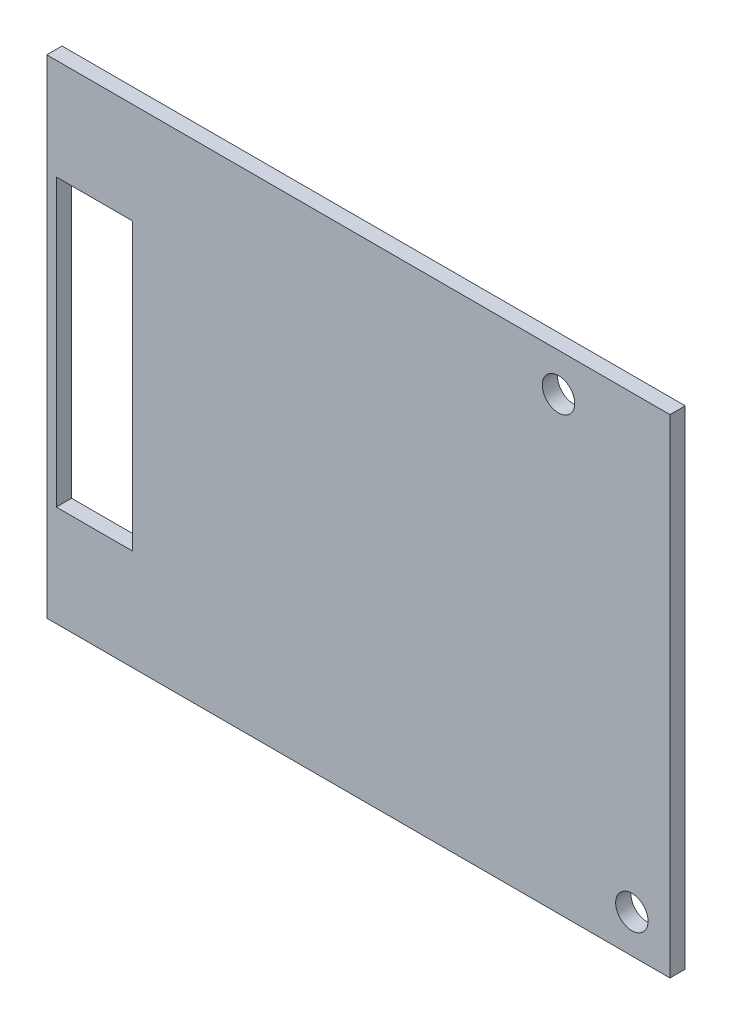
ISO-10303-21;
HEADER;
FILE_DESCRIPTION(('STEP AP214'),'2;1');
FILE_NAME('part.step','',(''),(''),'','','');
FILE_SCHEMA(('AUTOMOTIVE_DESIGN { 1 0 10303 214 1 1 1 1 }'));
ENDSEC;
DATA;
#1=APPLICATION_CONTEXT('core data for automotive mechanical design processes');
#2=APPLICATION_PROTOCOL_DEFINITION('international standard','automotive_design',2000,#1);
#3=PRODUCT_CONTEXT('',#1,'mechanical');
#4=PRODUCT('Part','Part','',(#3));
#5=PRODUCT_RELATED_PRODUCT_CATEGORY('part','',(#4));
#6=PRODUCT_DEFINITION_FORMATION('','',#4);
#7=PRODUCT_DEFINITION_CONTEXT('part definition',#1,'design');
#8=PRODUCT_DEFINITION('design','',#6,#7);
#9=PRODUCT_DEFINITION_SHAPE('','',#8);
#10=(LENGTH_UNIT() NAMED_UNIT(*) SI_UNIT(.MILLI.,.METRE.));
#11=(NAMED_UNIT(*) PLANE_ANGLE_UNIT() SI_UNIT($,.RADIAN.));
#12=(NAMED_UNIT(*) SI_UNIT($,.STERADIAN.) SOLID_ANGLE_UNIT());
#13=UNCERTAINTY_MEASURE_WITH_UNIT(LENGTH_MEASURE(1.E-05),#10,'distance_accuracy_value','');
#14=(GEOMETRIC_REPRESENTATION_CONTEXT(3) GLOBAL_UNCERTAINTY_ASSIGNED_CONTEXT((#13)) GLOBAL_UNIT_ASSIGNED_CONTEXT((#10,
#11,#12)) REPRESENTATION_CONTEXT('',''));
#15=CARTESIAN_POINT('',(0.,0.,0.));
#16=DIRECTION('',(0.,0.,1.));
#17=DIRECTION('',(1.,0.,0.));
#18=AXIS2_PLACEMENT_3D('',#15,#16,#17);
#19=CARTESIAN_POINT('',(0.,0.,1.6));
#20=DIRECTION('',(0.,0.,1.));
#21=DIRECTION('',(1.,0.,0.));
#22=AXIS2_PLACEMENT_3D('',#19,#20,#21);
#23=PLANE('',#22);
#24=CARTESIAN_POINT('',(61.4,4.,1.6));
#25=DIRECTION('',(0.,0.,1.));
#26=DIRECTION('',(1.,0.,0.));
#27=AXIS2_PLACEMENT_3D('',#24,#25,#26);
#28=CIRCLE('',#27,1.70000000000001);
#29=CARTESIAN_POINT('',(63.1,4.,1.6));
#30=VERTEX_POINT('',#29);
#31=EDGE_CURVE('E128',#30,#30,#28,.T.);
#32=ORIENTED_EDGE('',*,*,#31,.F.);
#33=EDGE_LOOP('',(#32));
#34=FACE_BOUND('',#33,.T.);
#35=DIRECTION('',(0.,-1.,0.));
#36=VECTOR('',#35,1.);
#37=CARTESIAN_POINT('',(0.,51.2,1.6));
#38=LINE('',#37,#36);
#39=CARTESIAN_POINT('',(0.,51.2,1.6));
#40=VERTEX_POINT('',#39);
#41=CARTESIAN_POINT('',(0.,0.,1.6));
#42=VERTEX_POINT('',#41);
#43=EDGE_CURVE('E138',#40,#42,#38,.T.);
#44=ORIENTED_EDGE('',*,*,#43,.T.);
#45=DIRECTION('',(1.,0.,0.));
#46=VECTOR('',#45,1.);
#47=CARTESIAN_POINT('',(0.,0.,1.6));
#48=LINE('',#47,#46);
#49=CARTESIAN_POINT('',(65.4,0.,1.6));
#50=VERTEX_POINT('',#49);
#51=EDGE_CURVE('E141',#42,#50,#48,.T.);
#52=ORIENTED_EDGE('',*,*,#51,.T.);
#53=DIRECTION('',(0.,1.,0.));
#54=VECTOR('',#53,1.);
#55=CARTESIAN_POINT('',(65.4,51.2,1.6));
#56=LINE('',#55,#54);
#57=CARTESIAN_POINT('',(65.4,51.2,1.6));
#58=VERTEX_POINT('',#57);
#59=EDGE_CURVE('E144',#50,#58,#56,.T.);
#60=ORIENTED_EDGE('',*,*,#59,.T.);
#61=DIRECTION('',(-1.,0.,0.));
#62=VECTOR('',#61,1.);
#63=CARTESIAN_POINT('',(0.,51.2,1.6));
#64=LINE('',#63,#62);
#65=EDGE_CURVE('E146',#58,#40,#64,.T.);
#66=ORIENTED_EDGE('',*,*,#65,.T.);
#67=EDGE_LOOP('',(#44,#52,#60,#66));
#68=FACE_BOUND('',#67,.T.);
#69=DIRECTION('',(1.,0.,0.));
#70=VECTOR('',#69,1.);
#71=CARTESIAN_POINT('',(1.,10.6,1.6));
#72=LINE('',#71,#70);
#73=CARTESIAN_POINT('',(1.,10.6,1.6));
#74=VERTEX_POINT('',#73);
#75=CARTESIAN_POINT('',(9.00000000000001,10.6,1.6));
#76=VERTEX_POINT('',#75);
#77=EDGE_CURVE('E107',#74,#76,#72,.T.);
#78=ORIENTED_EDGE('',*,*,#77,.F.);
#79=DIRECTION('',(0.,-1.,0.));
#80=VECTOR('',#79,1.);
#81=CARTESIAN_POINT('',(1.,40.6,1.6));
#82=LINE('',#81,#80);
#83=CARTESIAN_POINT('',(1.,40.6,1.6));
#84=VERTEX_POINT('',#83);
#85=EDGE_CURVE('E99',#84,#74,#82,.T.);
#86=ORIENTED_EDGE('',*,*,#85,.F.);
#87=DIRECTION('',(-1.,0.,0.));
#88=VECTOR('',#87,1.);
#89=CARTESIAN_POINT('',(1.,40.6,1.6));
#90=LINE('',#89,#88);
#91=CARTESIAN_POINT('',(9.00000000000001,40.6,1.6));
#92=VERTEX_POINT('',#91);
#93=EDGE_CURVE('E122',#92,#84,#90,.T.);
#94=ORIENTED_EDGE('',*,*,#93,.F.);
#95=DIRECTION('',(0.,1.,0.));
#96=VECTOR('',#95,1.);
#97=CARTESIAN_POINT('',(9.00000000000001,40.6,1.6));
#98=LINE('',#97,#96);
#99=EDGE_CURVE('E120',#76,#92,#98,.T.);
#100=ORIENTED_EDGE('',*,*,#99,.F.);
#101=EDGE_LOOP('',(#78,#86,#94,#100));
#102=FACE_BOUND('',#101,.T.);
#103=CARTESIAN_POINT('',(53.7,47.2,1.6));
#104=DIRECTION('',(0.,0.,1.));
#105=DIRECTION('',(1.,0.,0.));
#106=AXIS2_PLACEMENT_3D('',#103,#104,#105);
#107=CIRCLE('',#106,1.7);
#108=CARTESIAN_POINT('',(55.4,47.2,1.6));
#109=VERTEX_POINT('',#108);
#110=EDGE_CURVE('E228',#109,#109,#107,.T.);
#111=ORIENTED_EDGE('',*,*,#110,.F.);
#112=EDGE_LOOP('',(#111));
#113=FACE_BOUND('',#112,.T.);
#114=ADVANCED_FACE('F34',(#34,#68,#102,#113),#23,.T.);
#115=CARTESIAN_POINT('',(0.,0.,0.));
#116=DIRECTION('',(0.,0.,1.));
#117=DIRECTION('',(1.,0.,0.));
#118=AXIS2_PLACEMENT_3D('',#115,#116,#117);
#119=PLANE('',#118);
#120=DIRECTION('',(0.,-1.,0.));
#121=VECTOR('',#120,1.);
#122=CARTESIAN_POINT('',(0.,51.2,0.));
#123=LINE('',#122,#121);
#124=CARTESIAN_POINT('',(0.,51.2,0.));
#125=VERTEX_POINT('',#124);
#126=CARTESIAN_POINT('',(0.,0.,0.));
#127=VERTEX_POINT('',#126);
#128=EDGE_CURVE('E115',#125,#127,#123,.T.);
#129=ORIENTED_EDGE('',*,*,#128,.F.);
#130=DIRECTION('',(-1.,0.,0.));
#131=VECTOR('',#130,1.);
#132=CARTESIAN_POINT('',(0.,51.2,0.));
#133=LINE('',#132,#131);
#134=CARTESIAN_POINT('',(65.4,51.2,0.));
#135=VERTEX_POINT('',#134);
#136=EDGE_CURVE('E142',#135,#125,#133,.T.);
#137=ORIENTED_EDGE('',*,*,#136,.F.);
#138=DIRECTION('',(0.,1.,0.));
#139=VECTOR('',#138,1.);
#140=CARTESIAN_POINT('',(65.4,51.2,0.));
#141=LINE('',#140,#139);
#142=CARTESIAN_POINT('',(65.4,0.,0.));
#143=VERTEX_POINT('',#142);
#144=EDGE_CURVE('E153',#143,#135,#141,.T.);
#145=ORIENTED_EDGE('',*,*,#144,.F.);
#146=DIRECTION('',(1.,0.,0.));
#147=VECTOR('',#146,1.);
#148=CARTESIAN_POINT('',(0.,0.,0.));
#149=LINE('',#148,#147);
#150=EDGE_CURVE('E151',#127,#143,#149,.T.);
#151=ORIENTED_EDGE('',*,*,#150,.F.);
#152=EDGE_LOOP('',(#129,#137,#145,#151));
#153=FACE_BOUND('',#152,.T.);
#154=DIRECTION('',(0.,-1.,0.));
#155=VECTOR('',#154,1.);
#156=CARTESIAN_POINT('',(1.,40.6,0.));
#157=LINE('',#156,#155);
#158=CARTESIAN_POINT('',(1.,40.6,0.));
#159=VERTEX_POINT('',#158);
#160=CARTESIAN_POINT('',(1.,10.6,0.));
#161=VERTEX_POINT('',#160);
#162=EDGE_CURVE('E57',#159,#161,#157,.T.);
#163=ORIENTED_EDGE('',*,*,#162,.T.);
#164=DIRECTION('',(1.,0.,0.));
#165=VECTOR('',#164,1.);
#166=CARTESIAN_POINT('',(1.,10.6,0.));
#167=LINE('',#166,#165);
#168=CARTESIAN_POINT('',(9.00000000000001,10.6,0.));
#169=VERTEX_POINT('',#168);
#170=EDGE_CURVE('E114',#161,#169,#167,.T.);
#171=ORIENTED_EDGE('',*,*,#170,.T.);
#172=DIRECTION('',(0.,1.,0.));
#173=VECTOR('',#172,1.);
#174=CARTESIAN_POINT('',(9.00000000000001,40.6,0.));
#175=LINE('',#174,#173);
#176=CARTESIAN_POINT('',(9.00000000000001,40.6,0.));
#177=VERTEX_POINT('',#176);
#178=EDGE_CURVE('E130',#169,#177,#175,.T.);
#179=ORIENTED_EDGE('',*,*,#178,.T.);
#180=DIRECTION('',(-1.,0.,0.));
#181=VECTOR('',#180,1.);
#182=CARTESIAN_POINT('',(1.,40.6,0.));
#183=LINE('',#182,#181);
#184=EDGE_CURVE('E108',#177,#159,#183,.T.);
#185=ORIENTED_EDGE('',*,*,#184,.T.);
#186=EDGE_LOOP('',(#163,#171,#179,#185));
#187=FACE_BOUND('',#186,.T.);
#188=CARTESIAN_POINT('',(61.4,4.,0.));
#189=DIRECTION('',(0.,0.,1.));
#190=DIRECTION('',(1.,0.,0.));
#191=AXIS2_PLACEMENT_3D('',#188,#189,#190);
#192=CIRCLE('',#191,1.70000000000001);
#193=CARTESIAN_POINT('',(63.1,4.,0.));
#194=VERTEX_POINT('',#193);
#195=EDGE_CURVE('E234',#194,#194,#192,.T.);
#196=ORIENTED_EDGE('',*,*,#195,.T.);
#197=EDGE_LOOP('',(#196));
#198=FACE_BOUND('',#197,.T.);
#199=CARTESIAN_POINT('',(53.7,47.2,0.));
#200=DIRECTION('',(0.,0.,1.));
#201=DIRECTION('',(1.,0.,0.));
#202=AXIS2_PLACEMENT_3D('',#199,#200,#201);
#203=CIRCLE('',#202,1.7);
#204=CARTESIAN_POINT('',(55.4,47.2,0.));
#205=VERTEX_POINT('',#204);
#206=EDGE_CURVE('E231',#205,#205,#203,.T.);
#207=ORIENTED_EDGE('',*,*,#206,.T.);
#208=EDGE_LOOP('',(#207));
#209=FACE_BOUND('',#208,.T.);
#210=ADVANCED_FACE('F171',(#153,#187,#198,#209),#119,.F.);
#211=CARTESIAN_POINT('',(0.,51.2,1.6));
#212=DIRECTION('',(1.,0.,0.));
#213=DIRECTION('',(0.,0.,-1.));
#214=AXIS2_PLACEMENT_3D('',#211,#212,#213);
#215=PLANE('',#214);
#216=ORIENTED_EDGE('',*,*,#128,.T.);
#217=DIRECTION('',(0.,0.,-1.));
#218=VECTOR('',#217,1.);
#219=CARTESIAN_POINT('',(0.,0.,1.6));
#220=LINE('',#219,#218);
#221=EDGE_CURVE('E11',#42,#127,#220,.T.);
#222=ORIENTED_EDGE('',*,*,#221,.F.);
#223=ORIENTED_EDGE('',*,*,#43,.F.);
#224=DIRECTION('',(0.,0.,-1.));
#225=VECTOR('',#224,1.);
#226=CARTESIAN_POINT('',(0.,51.2,1.6));
#227=LINE('',#226,#225);
#228=EDGE_CURVE('E148',#40,#125,#227,.T.);
#229=ORIENTED_EDGE('',*,*,#228,.T.);
#230=EDGE_LOOP('',(#216,#222,#223,#229));
#231=FACE_BOUND('',#230,.T.);
#232=ADVANCED_FACE('F36',(#231),#215,.F.);
#233=CARTESIAN_POINT('',(0.,0.,1.6));
#234=DIRECTION('',(0.,1.,0.));
#235=DIRECTION('',(0.,0.,1.));
#236=AXIS2_PLACEMENT_3D('',#233,#234,#235);
#237=PLANE('',#236);
#238=ORIENTED_EDGE('',*,*,#150,.T.);
#239=DIRECTION('',(0.,0.,-1.));
#240=VECTOR('',#239,1.);
#241=CARTESIAN_POINT('',(65.4,0.,1.6));
#242=LINE('',#241,#240);
#243=EDGE_CURVE('E42',#50,#143,#242,.T.);
#244=ORIENTED_EDGE('',*,*,#243,.F.);
#245=ORIENTED_EDGE('',*,*,#51,.F.);
#246=ORIENTED_EDGE('',*,*,#221,.T.);
#247=EDGE_LOOP('',(#238,#244,#245,#246));
#248=FACE_BOUND('',#247,.T.);
#249=ADVANCED_FACE('F181',(#248),#237,.F.);
#250=CARTESIAN_POINT('',(65.4,51.2,1.6));
#251=DIRECTION('',(-1.,0.,0.));
#252=DIRECTION('',(0.,0.,1.));
#253=AXIS2_PLACEMENT_3D('',#250,#251,#252);
#254=PLANE('',#253);
#255=ORIENTED_EDGE('',*,*,#144,.T.);
#256=DIRECTION('',(0.,0.,-1.));
#257=VECTOR('',#256,1.);
#258=CARTESIAN_POINT('',(65.4,51.2,1.6));
#259=LINE('',#258,#257);
#260=EDGE_CURVE('E158',#58,#135,#259,.T.);
#261=ORIENTED_EDGE('',*,*,#260,.F.);
#262=ORIENTED_EDGE('',*,*,#59,.F.);
#263=ORIENTED_EDGE('',*,*,#243,.T.);
#264=EDGE_LOOP('',(#255,#261,#262,#263));
#265=FACE_BOUND('',#264,.T.);
#266=ADVANCED_FACE('F165',(#265),#254,.F.);
#267=CARTESIAN_POINT('',(0.,51.2,1.6));
#268=DIRECTION('',(0.,-1.,0.));
#269=DIRECTION('',(0.,0.,-1.));
#270=AXIS2_PLACEMENT_3D('',#267,#268,#269);
#271=PLANE('',#270);
#272=ORIENTED_EDGE('',*,*,#136,.T.);
#273=ORIENTED_EDGE('',*,*,#228,.F.);
#274=ORIENTED_EDGE('',*,*,#65,.F.);
#275=ORIENTED_EDGE('',*,*,#260,.T.);
#276=EDGE_LOOP('',(#272,#273,#274,#275));
#277=FACE_BOUND('',#276,.T.);
#278=ADVANCED_FACE('F175',(#277),#271,.F.);
#279=CARTESIAN_POINT('',(1.,40.6,1.6));
#280=DIRECTION('',(1.,0.,0.));
#281=DIRECTION('',(0.,0.,-1.));
#282=AXIS2_PLACEMENT_3D('',#279,#280,#281);
#283=PLANE('',#282);
#284=ORIENTED_EDGE('',*,*,#162,.F.);
#285=DIRECTION('',(0.,0.,-1.));
#286=VECTOR('',#285,1.);
#287=CARTESIAN_POINT('',(1.,40.6,1.6));
#288=LINE('',#287,#286);
#289=EDGE_CURVE('E103',#84,#159,#288,.T.);
#290=ORIENTED_EDGE('',*,*,#289,.F.);
#291=ORIENTED_EDGE('',*,*,#85,.T.);
#292=DIRECTION('',(0.,0.,-1.));
#293=VECTOR('',#292,1.);
#294=CARTESIAN_POINT('',(1.,10.6,1.6));
#295=LINE('',#294,#293);
#296=EDGE_CURVE('E102',#74,#161,#295,.T.);
#297=ORIENTED_EDGE('',*,*,#296,.T.);
#298=EDGE_LOOP('',(#284,#290,#291,#297));
#299=FACE_BOUND('',#298,.T.);
#300=ADVANCED_FACE('F101',(#299),#283,.T.);
#301=CARTESIAN_POINT('',(1.,10.6,1.6));
#302=DIRECTION('',(0.,1.,0.));
#303=DIRECTION('',(0.,0.,1.));
#304=AXIS2_PLACEMENT_3D('',#301,#302,#303);
#305=PLANE('',#304);
#306=ORIENTED_EDGE('',*,*,#170,.F.);
#307=ORIENTED_EDGE('',*,*,#296,.F.);
#308=ORIENTED_EDGE('',*,*,#77,.T.);
#309=DIRECTION('',(0.,0.,-1.));
#310=VECTOR('',#309,1.);
#311=CARTESIAN_POINT('',(9.00000000000001,10.6,1.6));
#312=LINE('',#311,#310);
#313=EDGE_CURVE('E116',#76,#169,#312,.T.);
#314=ORIENTED_EDGE('',*,*,#313,.T.);
#315=EDGE_LOOP('',(#306,#307,#308,#314));
#316=FACE_BOUND('',#315,.T.);
#317=ADVANCED_FACE('F111',(#316),#305,.T.);
#318=CARTESIAN_POINT('',(9.00000000000001,40.6,1.6));
#319=DIRECTION('',(-1.,0.,0.));
#320=DIRECTION('',(0.,0.,1.));
#321=AXIS2_PLACEMENT_3D('',#318,#319,#320);
#322=PLANE('',#321);
#323=ORIENTED_EDGE('',*,*,#178,.F.);
#324=ORIENTED_EDGE('',*,*,#313,.F.);
#325=ORIENTED_EDGE('',*,*,#99,.T.);
#326=DIRECTION('',(0.,0.,-1.));
#327=VECTOR('',#326,1.);
#328=CARTESIAN_POINT('',(9.00000000000001,40.6,1.6));
#329=LINE('',#328,#327);
#330=EDGE_CURVE('E49',#92,#177,#329,.T.);
#331=ORIENTED_EDGE('',*,*,#330,.T.);
#332=EDGE_LOOP('',(#323,#324,#325,#331));
#333=FACE_BOUND('',#332,.T.);
#334=ADVANCED_FACE('F206',(#333),#322,.T.);
#335=CARTESIAN_POINT('',(1.,40.6,1.6));
#336=DIRECTION('',(0.,-1.,0.));
#337=DIRECTION('',(0.,0.,-1.));
#338=AXIS2_PLACEMENT_3D('',#335,#336,#337);
#339=PLANE('',#338);
#340=ORIENTED_EDGE('',*,*,#184,.F.);
#341=ORIENTED_EDGE('',*,*,#330,.F.);
#342=ORIENTED_EDGE('',*,*,#93,.T.);
#343=ORIENTED_EDGE('',*,*,#289,.T.);
#344=EDGE_LOOP('',(#340,#341,#342,#343));
#345=FACE_BOUND('',#344,.T.);
#346=ADVANCED_FACE('F210',(#345),#339,.T.);
#347=CARTESIAN_POINT('',(61.4,4.,1.6));
#348=DIRECTION('',(0.,0.,-1.));
#349=DIRECTION('',(-1.,0.,0.));
#350=AXIS2_PLACEMENT_3D('',#347,#348,#349);
#351=CYLINDRICAL_SURFACE('',#350,1.70000000000001);
#352=ORIENTED_EDGE('',*,*,#31,.T.);
#353=EDGE_LOOP('',(#352));
#354=FACE_BOUND('',#353,.T.);
#355=ORIENTED_EDGE('',*,*,#195,.F.);
#356=EDGE_LOOP('',(#355));
#357=FACE_BOUND('',#356,.T.);
#358=ADVANCED_FACE('F216',(#354,#357),#351,.F.);
#359=CARTESIAN_POINT('',(53.7,47.2,1.6));
#360=DIRECTION('',(0.,0.,-1.));
#361=DIRECTION('',(-1.,0.,0.));
#362=AXIS2_PLACEMENT_3D('',#359,#360,#361);
#363=CYLINDRICAL_SURFACE('',#362,1.7);
#364=ORIENTED_EDGE('',*,*,#110,.T.);
#365=EDGE_LOOP('',(#364));
#366=FACE_BOUND('',#365,.T.);
#367=ORIENTED_EDGE('',*,*,#206,.F.);
#368=EDGE_LOOP('',(#367));
#369=FACE_BOUND('',#368,.T.);
#370=ADVANCED_FACE('F219',(#366,#369),#363,.F.);
#371=CLOSED_SHELL('',(#114,#210,#232,#249,#266,#278,#300,#317,#334,#346,#358,#370));
#372=MANIFOLD_SOLID_BREP('B2',#371);
#373=ADVANCED_BREP_SHAPE_REPRESENTATION('',(#18,#372),#14);
#374=SHAPE_DEFINITION_REPRESENTATION(#9,#373);
ENDSEC;
END-ISO-10303-21;
